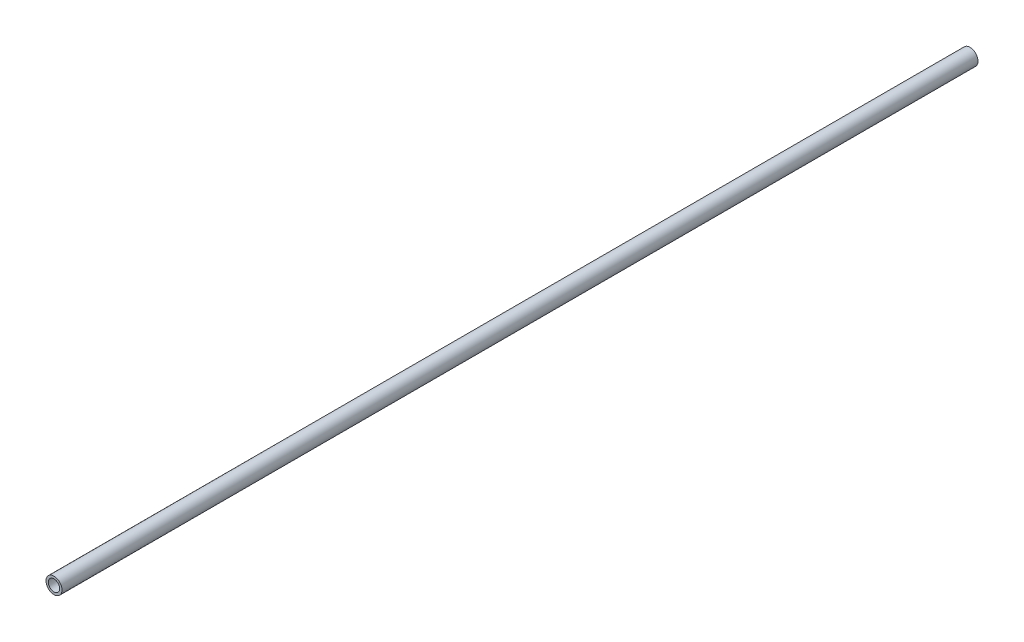
ISO-10303-21;
HEADER;
FILE_DESCRIPTION(('STEP AP214'),'2;1');
FILE_NAME('part.step','',(''),(''),'','','');
FILE_SCHEMA(('AUTOMOTIVE_DESIGN { 1 0 10303 214 1 1 1 1 }'));
ENDSEC;
DATA;
#1=APPLICATION_CONTEXT('core data for automotive mechanical design processes');
#2=APPLICATION_PROTOCOL_DEFINITION('international standard','automotive_design',2000,#1);
#3=PRODUCT_CONTEXT('',#1,'mechanical');
#4=PRODUCT('Part','Part','',(#3));
#5=PRODUCT_RELATED_PRODUCT_CATEGORY('part','',(#4));
#6=PRODUCT_DEFINITION_FORMATION('','',#4);
#7=PRODUCT_DEFINITION_CONTEXT('part definition',#1,'design');
#8=PRODUCT_DEFINITION('design','',#6,#7);
#9=PRODUCT_DEFINITION_SHAPE('','',#8);
#10=(LENGTH_UNIT() NAMED_UNIT(*) SI_UNIT(.MILLI.,.METRE.));
#11=(NAMED_UNIT(*) PLANE_ANGLE_UNIT() SI_UNIT($,.RADIAN.));
#12=(NAMED_UNIT(*) SI_UNIT($,.STERADIAN.) SOLID_ANGLE_UNIT());
#13=UNCERTAINTY_MEASURE_WITH_UNIT(LENGTH_MEASURE(1.E-05),#10,'distance_accuracy_value','');
#14=(GEOMETRIC_REPRESENTATION_CONTEXT(3) GLOBAL_UNCERTAINTY_ASSIGNED_CONTEXT((#13)) GLOBAL_UNIT_ASSIGNED_CONTEXT((#10,
#11,#12)) REPRESENTATION_CONTEXT('',''));
#15=CARTESIAN_POINT('',(0.,0.,0.));
#16=DIRECTION('',(0.,0.,1.));
#17=DIRECTION('',(1.,0.,0.));
#18=AXIS2_PLACEMENT_3D('',#15,#16,#17);
#19=CARTESIAN_POINT('',(0.,0.,762.));
#20=DIRECTION('',(0.,0.,1.));
#21=DIRECTION('',(1.,0.,0.));
#22=AXIS2_PLACEMENT_3D('',#19,#20,#21);
#23=PLANE('',#22);
#24=CARTESIAN_POINT('',(0.,0.,762.));
#25=DIRECTION('',(0.,0.,1.));
#26=DIRECTION('',(1.,0.,0.));
#27=AXIS2_PLACEMENT_3D('',#24,#25,#26);
#28=CIRCLE('',#27,13.335);
#29=CARTESIAN_POINT('',(13.335,0.,762.));
#30=VERTEX_POINT('',#29);
#31=EDGE_CURVE('E11',#30,#30,#28,.T.);
#32=ORIENTED_EDGE('',*,*,#31,.T.);
#33=EDGE_LOOP('',(#32));
#34=FACE_BOUND('',#33,.T.);
#35=CARTESIAN_POINT('',(0.,0.,762.));
#36=DIRECTION('',(0.,0.,1.));
#37=DIRECTION('',(1.,0.,0.));
#38=AXIS2_PLACEMENT_3D('',#35,#36,#37);
#39=CIRCLE('',#38,9.4234);
#40=CARTESIAN_POINT('',(9.4234,0.,762.));
#41=VERTEX_POINT('',#40);
#42=EDGE_CURVE('E46',#41,#41,#39,.T.);
#43=ORIENTED_EDGE('',*,*,#42,.F.);
#44=EDGE_LOOP('',(#43));
#45=FACE_BOUND('',#44,.T.);
#46=ADVANCED_FACE('F35',(#34,#45),#23,.T.);
#47=CARTESIAN_POINT('',(0.,0.,-762.));
#48=DIRECTION('',(0.,0.,1.));
#49=DIRECTION('',(1.,0.,0.));
#50=AXIS2_PLACEMENT_3D('',#47,#48,#49);
#51=PLANE('',#50);
#52=CARTESIAN_POINT('',(0.,0.,-762.));
#53=DIRECTION('',(0.,0.,1.));
#54=DIRECTION('',(1.,0.,0.));
#55=AXIS2_PLACEMENT_3D('',#52,#53,#54);
#56=CIRCLE('',#55,13.335);
#57=CARTESIAN_POINT('',(13.335,0.,-762.));
#58=VERTEX_POINT('',#57);
#59=EDGE_CURVE('E39',#58,#58,#56,.T.);
#60=ORIENTED_EDGE('',*,*,#59,.F.);
#61=EDGE_LOOP('',(#60));
#62=FACE_BOUND('',#61,.T.);
#63=CARTESIAN_POINT('',(0.,0.,-762.));
#64=DIRECTION('',(0.,0.,1.));
#65=DIRECTION('',(1.,0.,0.));
#66=AXIS2_PLACEMENT_3D('',#63,#64,#65);
#67=CIRCLE('',#66,9.4234);
#68=CARTESIAN_POINT('',(9.4234,0.,-762.));
#69=VERTEX_POINT('',#68);
#70=EDGE_CURVE('E48',#69,#69,#67,.T.);
#71=ORIENTED_EDGE('',*,*,#70,.T.);
#72=EDGE_LOOP('',(#71));
#73=FACE_BOUND('',#72,.T.);
#74=ADVANCED_FACE('F58',(#62,#73),#51,.F.);
#75=CARTESIAN_POINT('',(0.,0.,762.));
#76=DIRECTION('',(0.,0.,-1.));
#77=DIRECTION('',(-1.,0.,0.));
#78=AXIS2_PLACEMENT_3D('',#75,#76,#77);
#79=CYLINDRICAL_SURFACE('',#78,13.335);
#80=ORIENTED_EDGE('',*,*,#31,.F.);
#81=EDGE_LOOP('',(#80));
#82=FACE_BOUND('',#81,.T.);
#83=ORIENTED_EDGE('',*,*,#59,.T.);
#84=EDGE_LOOP('',(#83));
#85=FACE_BOUND('',#84,.T.);
#86=ADVANCED_FACE('F37',(#82,#85),#79,.T.);
#87=CARTESIAN_POINT('',(0.,0.,762.));
#88=DIRECTION('',(0.,0.,-1.));
#89=DIRECTION('',(-1.,0.,0.));
#90=AXIS2_PLACEMENT_3D('',#87,#88,#89);
#91=CYLINDRICAL_SURFACE('',#90,9.4234);
#92=ORIENTED_EDGE('',*,*,#42,.T.);
#93=EDGE_LOOP('',(#92));
#94=FACE_BOUND('',#93,.T.);
#95=ORIENTED_EDGE('',*,*,#70,.F.);
#96=EDGE_LOOP('',(#95));
#97=FACE_BOUND('',#96,.T.);
#98=ADVANCED_FACE('F54',(#94,#97),#91,.F.);
#99=CLOSED_SHELL('',(#46,#74,#86,#98));
#100=MANIFOLD_SOLID_BREP('B2',#99);
#101=ADVANCED_BREP_SHAPE_REPRESENTATION('',(#18,#100),#14);
#102=SHAPE_DEFINITION_REPRESENTATION(#9,#101);
ENDSEC;
END-ISO-10303-21;
